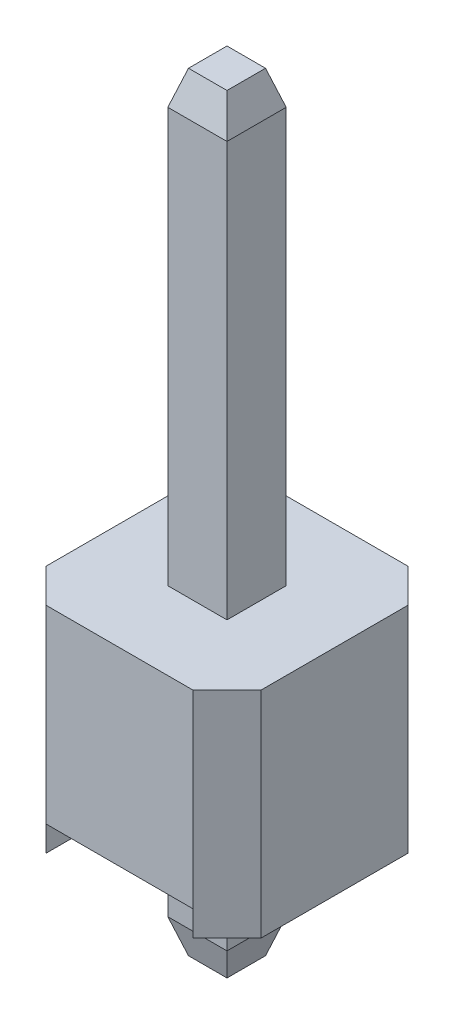
ISO-10303-21;
HEADER;
FILE_DESCRIPTION(('STEP AP214'),'2;1');
FILE_NAME('part.step','',(''),(''),'','','');
FILE_SCHEMA(('AUTOMOTIVE_DESIGN { 1 0 10303 214 1 1 1 1 }'));
ENDSEC;
DATA;
#1=APPLICATION_CONTEXT('core data for automotive mechanical design processes');
#2=APPLICATION_PROTOCOL_DEFINITION('international standard','automotive_design',2000,#1);
#3=PRODUCT_CONTEXT('',#1,'mechanical');
#4=PRODUCT('Part','Part','',(#3));
#5=PRODUCT_RELATED_PRODUCT_CATEGORY('part','',(#4));
#6=PRODUCT_DEFINITION_FORMATION('','',#4);
#7=PRODUCT_DEFINITION_CONTEXT('part definition',#1,'design');
#8=PRODUCT_DEFINITION('design','',#6,#7);
#9=PRODUCT_DEFINITION_SHAPE('','',#8);
#10=(LENGTH_UNIT() NAMED_UNIT(*) SI_UNIT(.MILLI.,.METRE.));
#11=(NAMED_UNIT(*) PLANE_ANGLE_UNIT() SI_UNIT($,.RADIAN.));
#12=(NAMED_UNIT(*) SI_UNIT($,.STERADIAN.) SOLID_ANGLE_UNIT());
#13=UNCERTAINTY_MEASURE_WITH_UNIT(LENGTH_MEASURE(1.E-05),#10,'distance_accuracy_value','');
#14=(GEOMETRIC_REPRESENTATION_CONTEXT(3) GLOBAL_UNCERTAINTY_ASSIGNED_CONTEXT((#13)) GLOBAL_UNIT_ASSIGNED_CONTEXT((#10,
#11,#12)) REPRESENTATION_CONTEXT('',''));
#15=CARTESIAN_POINT('',(0.,0.,0.));
#16=DIRECTION('',(0.,0.,1.));
#17=DIRECTION('',(1.,0.,0.));
#18=AXIS2_PLACEMENT_3D('',#15,#16,#17);
#19=CARTESIAN_POINT('',(0.,0.3,0.));
#20=DIRECTION('',(0.,-1.,0.));
#21=DIRECTION('',(0.,0.,-1.));
#22=AXIS2_PLACEMENT_3D('',#19,#20,#21);
#23=PLANE('',#22);
#24=DIRECTION('',(0.,0.,-1.));
#25=VECTOR('',#24,1.);
#26=CARTESIAN_POINT('',(-0.870000000000001,0.3,1.27));
#27=LINE('',#26,#25);
#28=CARTESIAN_POINT('',(-0.870000000000001,0.3,1.27));
#29=VERTEX_POINT('',#28);
#30=CARTESIAN_POINT('',(-0.870000000000001,0.3,-1.27));
#31=VERTEX_POINT('',#30);
#32=EDGE_CURVE('E237',#29,#31,#27,.T.);
#33=ORIENTED_EDGE('',*,*,#32,.T.);
#34=DIRECTION('',(1.,0.,0.));
#35=VECTOR('',#34,1.);
#36=CARTESIAN_POINT('',(-0.870000000000001,0.3,-1.27));
#37=LINE('',#36,#35);
#38=CARTESIAN_POINT('',(0.869999999999999,0.3,-1.27));
#39=VERTEX_POINT('',#38);
#40=EDGE_CURVE('E240',#31,#39,#37,.T.);
#41=ORIENTED_EDGE('',*,*,#40,.T.);
#42=DIRECTION('',(0.,0.,1.));
#43=VECTOR('',#42,1.);
#44=CARTESIAN_POINT('',(0.869999999999999,0.3,1.27));
#45=LINE('',#44,#43);
#46=CARTESIAN_POINT('',(0.869999999999999,0.3,1.27));
#47=VERTEX_POINT('',#46);
#48=EDGE_CURVE('E244',#39,#47,#45,.T.);
#49=ORIENTED_EDGE('',*,*,#48,.T.);
#50=DIRECTION('',(-1.,0.,0.));
#51=VECTOR('',#50,1.);
#52=CARTESIAN_POINT('',(-0.870000000000001,0.3,1.27));
#53=LINE('',#52,#51);
#54=EDGE_CURVE('E247',#47,#29,#53,.T.);
#55=ORIENTED_EDGE('',*,*,#54,.T.);
#56=EDGE_LOOP('',(#33,#41,#49,#55));
#57=FACE_BOUND('',#56,.T.);
#58=DIRECTION('',(-1.,0.,0.));
#59=VECTOR('',#58,1.);
#60=CARTESIAN_POINT('',(-0.35,0.3,0.35));
#61=LINE('',#60,#59);
#62=CARTESIAN_POINT('',(0.35,0.3,0.35));
#63=VERTEX_POINT('',#62);
#64=CARTESIAN_POINT('',(-0.35,0.3,0.35));
#65=VERTEX_POINT('',#64);
#66=EDGE_CURVE('E187',#63,#65,#61,.T.);
#67=ORIENTED_EDGE('',*,*,#66,.F.);
#68=DIRECTION('',(0.,0.,1.));
#69=VECTOR('',#68,1.);
#70=CARTESIAN_POINT('',(0.35,0.3,0.35));
#71=LINE('',#70,#69);
#72=CARTESIAN_POINT('',(0.35,0.3,-0.35));
#73=VERTEX_POINT('',#72);
#74=EDGE_CURVE('E197',#73,#63,#71,.T.);
#75=ORIENTED_EDGE('',*,*,#74,.F.);
#76=DIRECTION('',(1.,0.,0.));
#77=VECTOR('',#76,1.);
#78=CARTESIAN_POINT('',(-0.35,0.3,-0.35));
#79=LINE('',#78,#77);
#80=CARTESIAN_POINT('',(-0.35,0.3,-0.35));
#81=VERTEX_POINT('',#80);
#82=EDGE_CURVE('E209',#81,#73,#79,.T.);
#83=ORIENTED_EDGE('',*,*,#82,.F.);
#84=DIRECTION('',(0.,0.,-1.));
#85=VECTOR('',#84,1.);
#86=CARTESIAN_POINT('',(-0.35,0.3,0.35));
#87=LINE('',#86,#85);
#88=EDGE_CURVE('E207',#65,#81,#87,.T.);
#89=ORIENTED_EDGE('',*,*,#88,.F.);
#90=EDGE_LOOP('',(#67,#75,#83,#89));
#91=FACE_BOUND('',#90,.T.);
#92=ADVANCED_FACE('F33',(#57,#91),#23,.T.);
#93=CARTESIAN_POINT('',(0.,2.54,0.));
#94=DIRECTION('',(0.,1.,0.));
#95=DIRECTION('',(0.,0.,1.));
#96=AXIS2_PLACEMENT_3D('',#93,#94,#95);
#97=PLANE('',#96);
#98=DIRECTION('',(-1.,0.,0.));
#99=VECTOR('',#98,1.);
#100=CARTESIAN_POINT('',(-1.27,2.54,-1.27));
#101=LINE('',#100,#99);
#102=CARTESIAN_POINT('',(0.869999999999999,2.54,-1.27));
#103=VERTEX_POINT('',#102);
#104=CARTESIAN_POINT('',(-0.869999999999999,2.54,-1.27));
#105=VERTEX_POINT('',#104);
#106=EDGE_CURVE('E260',#103,#105,#101,.T.);
#107=ORIENTED_EDGE('',*,*,#106,.T.);
#108=DIRECTION('',(0.707106781186548,0.,-0.707106781186547));
#109=VECTOR('',#108,1.);
#110=CARTESIAN_POINT('',(-1.07,2.54,-1.07));
#111=LINE('',#110,#109);
#112=CARTESIAN_POINT('',(-1.27,2.54,-0.869999999999999));
#113=VERTEX_POINT('',#112);
#114=EDGE_CURVE('E301',#105,#113,#111,.F.);
#115=ORIENTED_EDGE('',*,*,#114,.T.);
#116=DIRECTION('',(0.,0.,1.));
#117=VECTOR('',#116,1.);
#118=CARTESIAN_POINT('',(-1.27,2.54,-1.27));
#119=LINE('',#118,#117);
#120=CARTESIAN_POINT('',(-1.27,2.54,0.869999999999999));
#121=VERTEX_POINT('',#120);
#122=EDGE_CURVE('E264',#113,#121,#119,.T.);
#123=ORIENTED_EDGE('',*,*,#122,.T.);
#124=DIRECTION('',(-0.707106781186546,0.,-0.707106781186549));
#125=VECTOR('',#124,1.);
#126=CARTESIAN_POINT('',(-1.07,2.54,1.07));
#127=LINE('',#126,#125);
#128=CARTESIAN_POINT('',(-0.87,2.54,1.27));
#129=VERTEX_POINT('',#128);
#130=EDGE_CURVE('E297',#121,#129,#127,.F.);
#131=ORIENTED_EDGE('',*,*,#130,.T.);
#132=DIRECTION('',(1.,0.,0.));
#133=VECTOR('',#132,1.);
#134=CARTESIAN_POINT('',(-1.27,2.54,1.27));
#135=LINE('',#134,#133);
#136=CARTESIAN_POINT('',(0.869999999999998,2.54,1.27));
#137=VERTEX_POINT('',#136);
#138=EDGE_CURVE('E267',#129,#137,#135,.T.);
#139=ORIENTED_EDGE('',*,*,#138,.T.);
#140=DIRECTION('',(-0.707106781186549,0.,0.707106781186546));
#141=VECTOR('',#140,1.);
#142=CARTESIAN_POINT('',(1.07,2.54,1.07));
#143=LINE('',#142,#141);
#144=CARTESIAN_POINT('',(1.27,2.54,0.869999999999999));
#145=VERTEX_POINT('',#144);
#146=EDGE_CURVE('E295',#137,#145,#143,.F.);
#147=ORIENTED_EDGE('',*,*,#146,.T.);
#148=DIRECTION('',(0.,0.,-1.));
#149=VECTOR('',#148,1.);
#150=CARTESIAN_POINT('',(1.27,2.54,-1.27));
#151=LINE('',#150,#149);
#152=CARTESIAN_POINT('',(1.27,2.54,-0.869999999999999));
#153=VERTEX_POINT('',#152);
#154=EDGE_CURVE('E257',#145,#153,#151,.T.);
#155=ORIENTED_EDGE('',*,*,#154,.T.);
#156=DIRECTION('',(0.707106781186547,0.,0.707106781186548));
#157=VECTOR('',#156,1.);
#158=CARTESIAN_POINT('',(1.07,2.54,-1.07));
#159=LINE('',#158,#157);
#160=EDGE_CURVE('E299',#153,#103,#159,.F.);
#161=ORIENTED_EDGE('',*,*,#160,.T.);
#162=EDGE_LOOP('',(#107,#115,#123,#131,#139,#147,#155,#161));
#163=FACE_BOUND('',#162,.T.);
#164=DIRECTION('',(1.,0.,0.));
#165=VECTOR('',#164,1.);
#166=CARTESIAN_POINT('',(0.35,2.54,0.35));
#167=LINE('',#166,#165);
#168=CARTESIAN_POINT('',(-0.35,2.54,0.35));
#169=VERTEX_POINT('',#168);
#170=CARTESIAN_POINT('',(0.35,2.54,0.35));
#171=VERTEX_POINT('',#170);
#172=EDGE_CURVE('E219',#169,#171,#167,.T.);
#173=ORIENTED_EDGE('',*,*,#172,.F.);
#174=DIRECTION('',(0.,0.,1.));
#175=VECTOR('',#174,1.);
#176=CARTESIAN_POINT('',(-0.35,2.54,-0.35));
#177=LINE('',#176,#175);
#178=CARTESIAN_POINT('',(-0.35,2.54,-0.35));
#179=VERTEX_POINT('',#178);
#180=EDGE_CURVE('E193',#179,#169,#177,.T.);
#181=ORIENTED_EDGE('',*,*,#180,.F.);
#182=DIRECTION('',(-1.,0.,0.));
#183=VECTOR('',#182,1.);
#184=CARTESIAN_POINT('',(0.35,2.54,-0.35));
#185=LINE('',#184,#183);
#186=CARTESIAN_POINT('',(0.35,2.54,-0.35));
#187=VERTEX_POINT('',#186);
#188=EDGE_CURVE('E225',#187,#179,#185,.T.);
#189=ORIENTED_EDGE('',*,*,#188,.F.);
#190=DIRECTION('',(0.,0.,-1.));
#191=VECTOR('',#190,1.);
#192=CARTESIAN_POINT('',(0.35,2.54,-0.35));
#193=LINE('',#192,#191);
#194=EDGE_CURVE('E222',#171,#187,#193,.T.);
#195=ORIENTED_EDGE('',*,*,#194,.F.);
#196=EDGE_LOOP('',(#173,#181,#189,#195));
#197=FACE_BOUND('',#196,.T.);
#198=ADVANCED_FACE('F397',(#163,#197),#97,.T.);
#199=CARTESIAN_POINT('',(-1.27,2.54,-1.27));
#200=DIRECTION('',(0.,0.,1.));
#201=DIRECTION('',(1.,0.,0.));
#202=AXIS2_PLACEMENT_3D('',#199,#200,#201);
#203=PLANE('',#202);
#204=ORIENTED_EDGE('',*,*,#40,.F.);
#205=DIRECTION('',(0.,1.,0.));
#206=VECTOR('',#205,1.);
#207=CARTESIAN_POINT('',(-0.869999999999999,2.54,-1.27));
#208=LINE('',#207,#206);
#209=EDGE_CURVE('E292',#31,#105,#208,.T.);
#210=ORIENTED_EDGE('',*,*,#209,.T.);
#211=ORIENTED_EDGE('',*,*,#106,.F.);
#212=DIRECTION('',(0.,-1.,0.));
#213=VECTOR('',#212,1.);
#214=CARTESIAN_POINT('',(0.869999999999999,2.54,-1.27));
#215=LINE('',#214,#213);
#216=EDGE_CURVE('E289',#103,#39,#215,.T.);
#217=ORIENTED_EDGE('',*,*,#216,.T.);
#218=EDGE_LOOP('',(#204,#210,#211,#217));
#219=FACE_BOUND('',#218,.T.);
#220=ADVANCED_FACE('F403',(#219),#203,.F.);
#221=CARTESIAN_POINT('',(-1.27,2.54,1.27));
#222=DIRECTION('',(0.,0.,-1.));
#223=DIRECTION('',(-1.,0.,0.));
#224=AXIS2_PLACEMENT_3D('',#221,#222,#223);
#225=PLANE('',#224);
#226=ORIENTED_EDGE('',*,*,#54,.F.);
#227=DIRECTION('',(0.,1.,0.));
#228=VECTOR('',#227,1.);
#229=CARTESIAN_POINT('',(0.869999999999999,2.54,1.27));
#230=LINE('',#229,#228);
#231=EDGE_CURVE('E308',#47,#137,#230,.T.);
#232=ORIENTED_EDGE('',*,*,#231,.T.);
#233=ORIENTED_EDGE('',*,*,#138,.F.);
#234=DIRECTION('',(0.,-1.,0.));
#235=VECTOR('',#234,1.);
#236=CARTESIAN_POINT('',(-0.87,2.54,1.27));
#237=LINE('',#236,#235);
#238=EDGE_CURVE('E311',#129,#29,#237,.T.);
#239=ORIENTED_EDGE('',*,*,#238,.T.);
#240=EDGE_LOOP('',(#226,#232,#233,#239));
#241=FACE_BOUND('',#240,.T.);
#242=ADVANCED_FACE('F425',(#241),#225,.F.);
#243=CARTESIAN_POINT('',(0.,0.,0.));
#244=DIRECTION('',(0.,1.,0.));
#245=DIRECTION('',(0.,0.,1.));
#246=AXIS2_PLACEMENT_3D('',#243,#244,#245);
#247=PLANE('',#246);
#248=DIRECTION('',(-0.707106781186548,0.,0.707106781186547));
#249=VECTOR('',#248,1.);
#250=CARTESIAN_POINT('',(-1.27,0.,-0.869999999999999));
#251=LINE('',#250,#249);
#252=CARTESIAN_POINT('',(-1.27,0.,-0.869999999999999));
#253=VERTEX_POINT('',#252);
#254=CARTESIAN_POINT('',(-0.870000000000001,0.,-1.27));
#255=VERTEX_POINT('',#254);
#256=EDGE_CURVE('E286',#253,#255,#251,.F.);
#257=ORIENTED_EDGE('',*,*,#256,.T.);
#258=DIRECTION('',(0.,0.,-1.));
#259=VECTOR('',#258,1.);
#260=CARTESIAN_POINT('',(-0.870000000000001,0.,1.27));
#261=LINE('',#260,#259);
#262=CARTESIAN_POINT('',(-0.870000000000001,0.,1.27));
#263=VERTEX_POINT('',#262);
#264=EDGE_CURVE('E236',#263,#255,#261,.T.);
#265=ORIENTED_EDGE('',*,*,#264,.F.);
#266=DIRECTION('',(0.707106781186546,0.,0.707106781186549));
#267=VECTOR('',#266,1.);
#268=CARTESIAN_POINT('',(-0.87,0.,1.27));
#269=LINE('',#268,#267);
#270=CARTESIAN_POINT('',(-1.27,0.,0.869999999999999));
#271=VERTEX_POINT('',#270);
#272=EDGE_CURVE('E282',#263,#271,#269,.F.);
#273=ORIENTED_EDGE('',*,*,#272,.T.);
#274=DIRECTION('',(0.,0.,1.));
#275=VECTOR('',#274,1.);
#276=CARTESIAN_POINT('',(-1.27,0.,-1.27));
#277=LINE('',#276,#275);
#278=EDGE_CURVE('E261',#253,#271,#277,.T.);
#279=ORIENTED_EDGE('',*,*,#278,.F.);
#280=EDGE_LOOP('',(#257,#265,#273,#279));
#281=FACE_BOUND('',#280,.T.);
#282=ADVANCED_FACE('F424',(#281),#247,.F.);
#283=CARTESIAN_POINT('',(1.27,2.54,-1.27));
#284=DIRECTION('',(-1.,0.,0.));
#285=DIRECTION('',(0.,0.,1.));
#286=AXIS2_PLACEMENT_3D('',#283,#284,#285);
#287=PLANE('',#286);
#288=DIRECTION('',(0.,0.,-1.));
#289=VECTOR('',#288,1.);
#290=CARTESIAN_POINT('',(1.27,0.,-1.27));
#291=LINE('',#290,#289);
#292=CARTESIAN_POINT('',(1.27,0.,0.87));
#293=VERTEX_POINT('',#292);
#294=CARTESIAN_POINT('',(1.27,0.,-0.869999999999998));
#295=VERTEX_POINT('',#294);
#296=EDGE_CURVE('E255',#293,#295,#291,.T.);
#297=ORIENTED_EDGE('',*,*,#296,.T.);
#298=DIRECTION('',(0.,1.,0.));
#299=VECTOR('',#298,1.);
#300=CARTESIAN_POINT('',(1.27,2.54,-0.869999999999998));
#301=LINE('',#300,#299);
#302=EDGE_CURVE('E306',#295,#153,#301,.T.);
#303=ORIENTED_EDGE('',*,*,#302,.T.);
#304=ORIENTED_EDGE('',*,*,#154,.F.);
#305=DIRECTION('',(0.,-1.,0.));
#306=VECTOR('',#305,1.);
#307=CARTESIAN_POINT('',(1.27,2.54,0.870000000000001));
#308=LINE('',#307,#306);
#309=EDGE_CURVE('E303',#145,#293,#308,.T.);
#310=ORIENTED_EDGE('',*,*,#309,.T.);
#311=EDGE_LOOP('',(#297,#303,#304,#310));
#312=FACE_BOUND('',#311,.T.);
#313=ADVANCED_FACE('F431',(#312),#287,.F.);
#314=CARTESIAN_POINT('',(-1.27,2.54,-1.27));
#315=DIRECTION('',(1.,0.,0.));
#316=DIRECTION('',(0.,0.,-1.));
#317=AXIS2_PLACEMENT_3D('',#314,#315,#316);
#318=PLANE('',#317);
#319=ORIENTED_EDGE('',*,*,#122,.F.);
#320=DIRECTION('',(0.,-1.,0.));
#321=VECTOR('',#320,1.);
#322=CARTESIAN_POINT('',(-1.27,2.54,-0.869999999999999));
#323=LINE('',#322,#321);
#324=EDGE_CURVE('E276',#113,#253,#323,.T.);
#325=ORIENTED_EDGE('',*,*,#324,.T.);
#326=ORIENTED_EDGE('',*,*,#278,.T.);
#327=DIRECTION('',(0.,1.,0.));
#328=VECTOR('',#327,1.);
#329=CARTESIAN_POINT('',(-1.27,2.54,0.869999999999999));
#330=LINE('',#329,#328);
#331=EDGE_CURVE('E270',#271,#121,#330,.T.);
#332=ORIENTED_EDGE('',*,*,#331,.T.);
#333=EDGE_LOOP('',(#319,#325,#326,#332));
#334=FACE_BOUND('',#333,.T.);
#335=ADVANCED_FACE('F422',(#334),#318,.F.);
#336=DIRECTION('',(0.707106781186549,0.,-0.707106781186546));
#337=VECTOR('',#336,1.);
#338=CARTESIAN_POINT('',(1.27,0.,0.870000000000001));
#339=LINE('',#338,#337);
#340=CARTESIAN_POINT('',(0.869999999999999,0.,1.27));
#341=VERTEX_POINT('',#340);
#342=EDGE_CURVE('E279',#293,#341,#339,.F.);
#343=ORIENTED_EDGE('',*,*,#342,.T.);
#344=DIRECTION('',(0.,0.,1.));
#345=VECTOR('',#344,1.);
#346=CARTESIAN_POINT('',(0.869999999999999,0.,1.27));
#347=LINE('',#346,#345);
#348=CARTESIAN_POINT('',(0.869999999999999,0.,-1.27));
#349=VERTEX_POINT('',#348);
#350=EDGE_CURVE('E241',#349,#341,#347,.T.);
#351=ORIENTED_EDGE('',*,*,#350,.F.);
#352=DIRECTION('',(-0.707106781186547,0.,-0.707106781186548));
#353=VECTOR('',#352,1.);
#354=CARTESIAN_POINT('',(0.869999999999999,0.,-1.27));
#355=LINE('',#354,#353);
#356=EDGE_CURVE('E284',#349,#295,#355,.F.);
#357=ORIENTED_EDGE('',*,*,#356,.T.);
#358=ORIENTED_EDGE('',*,*,#296,.F.);
#359=EDGE_LOOP('',(#343,#351,#357,#358));
#360=FACE_BOUND('',#359,.T.);
#361=ADVANCED_FACE('F418',(#360),#247,.F.);
#362=CARTESIAN_POINT('',(-1.27,2.54,-0.869999999999999));
#363=DIRECTION('',(0.707106781186547,0.,0.707106781186548));
#364=DIRECTION('',(0.,-1.,0.));
#365=AXIS2_PLACEMENT_3D('',#362,#363,#364);
#366=PLANE('',#365);
#367=ORIENTED_EDGE('',*,*,#114,.F.);
#368=ORIENTED_EDGE('',*,*,#209,.F.);
#369=EDGE_CURVE('E293',#255,#31,#208,.T.);
#370=ORIENTED_EDGE('',*,*,#369,.F.);
#371=ORIENTED_EDGE('',*,*,#256,.F.);
#372=ORIENTED_EDGE('',*,*,#324,.F.);
#373=EDGE_LOOP('',(#367,#368,#370,#371,#372));
#374=FACE_BOUND('',#373,.T.);
#375=ADVANCED_FACE('F421',(#374),#366,.F.);
#376=CARTESIAN_POINT('',(0.869999999999999,2.54,-1.27));
#377=DIRECTION('',(-0.707106781186548,0.,0.707106781186547));
#378=DIRECTION('',(0.,-1.,0.));
#379=AXIS2_PLACEMENT_3D('',#376,#377,#378);
#380=PLANE('',#379);
#381=ORIENTED_EDGE('',*,*,#160,.F.);
#382=ORIENTED_EDGE('',*,*,#302,.F.);
#383=ORIENTED_EDGE('',*,*,#356,.F.);
#384=DIRECTION('',(0.,-1.,0.));
#385=VECTOR('',#384,1.);
#386=CARTESIAN_POINT('',(0.869999999999999,0.3,-1.27));
#387=LINE('',#386,#385);
#388=EDGE_CURVE('E250',#39,#349,#387,.T.);
#389=ORIENTED_EDGE('',*,*,#388,.F.);
#390=ORIENTED_EDGE('',*,*,#216,.F.);
#391=EDGE_LOOP('',(#381,#382,#383,#389,#390));
#392=FACE_BOUND('',#391,.T.);
#393=ADVANCED_FACE('F441',(#392),#380,.F.);
#394=CARTESIAN_POINT('',(-0.87,2.54,1.27));
#395=DIRECTION('',(0.707106781186549,0.,-0.707106781186546));
#396=DIRECTION('',(0.,-1.,0.));
#397=AXIS2_PLACEMENT_3D('',#394,#395,#396);
#398=PLANE('',#397);
#399=ORIENTED_EDGE('',*,*,#130,.F.);
#400=ORIENTED_EDGE('',*,*,#331,.F.);
#401=ORIENTED_EDGE('',*,*,#272,.F.);
#402=DIRECTION('',(0.,-1.,0.));
#403=VECTOR('',#402,1.);
#404=CARTESIAN_POINT('',(-0.870000000000001,0.3,1.27));
#405=LINE('',#404,#403);
#406=EDGE_CURVE('E253',#29,#263,#405,.T.);
#407=ORIENTED_EDGE('',*,*,#406,.F.);
#408=ORIENTED_EDGE('',*,*,#238,.F.);
#409=EDGE_LOOP('',(#399,#400,#401,#407,#408));
#410=FACE_BOUND('',#409,.T.);
#411=ADVANCED_FACE('F445',(#410),#398,.F.);
#412=CARTESIAN_POINT('',(1.27,2.54,0.870000000000001));
#413=DIRECTION('',(-0.707106781186546,0.,-0.707106781186549));
#414=DIRECTION('',(0.,-1.,0.));
#415=AXIS2_PLACEMENT_3D('',#412,#413,#414);
#416=PLANE('',#415);
#417=ORIENTED_EDGE('',*,*,#146,.F.);
#418=ORIENTED_EDGE('',*,*,#231,.F.);
#419=EDGE_CURVE('E309',#341,#47,#230,.T.);
#420=ORIENTED_EDGE('',*,*,#419,.F.);
#421=ORIENTED_EDGE('',*,*,#342,.F.);
#422=ORIENTED_EDGE('',*,*,#309,.F.);
#423=EDGE_LOOP('',(#417,#418,#420,#421,#422));
#424=FACE_BOUND('',#423,.T.);
#425=ADVANCED_FACE('F415',(#424),#416,.F.);
#426=CARTESIAN_POINT('',(-0.870000000000001,0.3,1.27));
#427=DIRECTION('',(-1.,0.,0.));
#428=DIRECTION('',(0.,0.,1.));
#429=AXIS2_PLACEMENT_3D('',#426,#427,#428);
#430=PLANE('',#429);
#431=ORIENTED_EDGE('',*,*,#264,.T.);
#432=ORIENTED_EDGE('',*,*,#369,.T.);
#433=ORIENTED_EDGE('',*,*,#32,.F.);
#434=ORIENTED_EDGE('',*,*,#406,.T.);
#435=EDGE_LOOP('',(#431,#432,#433,#434));
#436=FACE_BOUND('',#435,.T.);
#437=ADVANCED_FACE('F412',(#436),#430,.F.);
#438=CARTESIAN_POINT('',(0.869999999999999,0.3,1.27));
#439=DIRECTION('',(1.,0.,0.));
#440=DIRECTION('',(0.,0.,-1.));
#441=AXIS2_PLACEMENT_3D('',#438,#439,#440);
#442=PLANE('',#441);
#443=ORIENTED_EDGE('',*,*,#350,.T.);
#444=ORIENTED_EDGE('',*,*,#419,.T.);
#445=ORIENTED_EDGE('',*,*,#48,.F.);
#446=ORIENTED_EDGE('',*,*,#388,.T.);
#447=EDGE_LOOP('',(#443,#444,#445,#446));
#448=FACE_BOUND('',#447,.T.);
#449=ADVANCED_FACE('F409',(#448),#442,.F.);
#450=CARTESIAN_POINT('',(-0.35,7.84,-0.35));
#451=DIRECTION('',(1.,0.,0.));
#452=DIRECTION('',(0.,0.,-1.));
#453=AXIS2_PLACEMENT_3D('',#450,#451,#452);
#454=PLANE('',#453);
#455=DIRECTION('',(0.,-1.,0.));
#456=VECTOR('',#455,1.);
#457=CARTESIAN_POINT('',(-0.35,7.84,0.35));
#458=LINE('',#457,#456);
#459=CARTESIAN_POINT('',(-0.35,7.44,0.35));
#460=VERTEX_POINT('',#459);
#461=EDGE_CURVE('E234',#460,#169,#458,.T.);
#462=ORIENTED_EDGE('',*,*,#461,.F.);
#463=DIRECTION('',(0.,0.,-1.));
#464=VECTOR('',#463,1.);
#465=CARTESIAN_POINT('',(-0.35,7.44,-0.35));
#466=LINE('',#465,#464);
#467=CARTESIAN_POINT('',(-0.35,7.44,-0.35));
#468=VERTEX_POINT('',#467);
#469=EDGE_CURVE('E343',#460,#468,#466,.T.);
#470=ORIENTED_EDGE('',*,*,#469,.T.);
#471=DIRECTION('',(0.,-1.,0.));
#472=VECTOR('',#471,1.);
#473=CARTESIAN_POINT('',(-0.35,7.84,-0.35));
#474=LINE('',#473,#472);
#475=EDGE_CURVE('E228',#468,#179,#474,.T.);
#476=ORIENTED_EDGE('',*,*,#475,.T.);
#477=ORIENTED_EDGE('',*,*,#180,.T.);
#478=EDGE_LOOP('',(#462,#470,#476,#477));
#479=FACE_BOUND('',#478,.T.);
#480=ADVANCED_FACE('F376',(#479),#454,.F.);
#481=CARTESIAN_POINT('',(0.35,7.84,0.35));
#482=DIRECTION('',(0.,0.,-1.));
#483=DIRECTION('',(-1.,0.,0.));
#484=AXIS2_PLACEMENT_3D('',#481,#482,#483);
#485=PLANE('',#484);
#486=DIRECTION('',(0.,-1.,0.));
#487=VECTOR('',#486,1.);
#488=CARTESIAN_POINT('',(0.35,7.84,0.35));
#489=LINE('',#488,#487);
#490=CARTESIAN_POINT('',(0.35,7.44,0.35));
#491=VERTEX_POINT('',#490);
#492=EDGE_CURVE('E232',#491,#171,#489,.T.);
#493=ORIENTED_EDGE('',*,*,#492,.F.);
#494=DIRECTION('',(-1.,0.,0.));
#495=VECTOR('',#494,1.);
#496=CARTESIAN_POINT('',(0.35,7.44,0.35));
#497=LINE('',#496,#495);
#498=EDGE_CURVE('E11',#491,#460,#497,.T.);
#499=ORIENTED_EDGE('',*,*,#498,.T.);
#500=ORIENTED_EDGE('',*,*,#461,.T.);
#501=ORIENTED_EDGE('',*,*,#172,.T.);
#502=EDGE_LOOP('',(#493,#499,#500,#501));
#503=FACE_BOUND('',#502,.T.);
#504=ADVANCED_FACE('F548',(#503),#485,.F.);
#505=CARTESIAN_POINT('',(0.35,7.84,-0.35));
#506=DIRECTION('',(-1.,0.,0.));
#507=DIRECTION('',(0.,0.,1.));
#508=AXIS2_PLACEMENT_3D('',#505,#506,#507);
#509=PLANE('',#508);
#510=DIRECTION('',(0.,-1.,0.));
#511=VECTOR('',#510,1.);
#512=CARTESIAN_POINT('',(0.35,7.84,-0.35));
#513=LINE('',#512,#511);
#514=CARTESIAN_POINT('',(0.35,7.44,-0.35));
#515=VERTEX_POINT('',#514);
#516=EDGE_CURVE('E230',#515,#187,#513,.T.);
#517=ORIENTED_EDGE('',*,*,#516,.F.);
#518=DIRECTION('',(0.,0.,1.));
#519=VECTOR('',#518,1.);
#520=CARTESIAN_POINT('',(0.35,7.44,-0.35));
#521=LINE('',#520,#519);
#522=EDGE_CURVE('E42',#515,#491,#521,.T.);
#523=ORIENTED_EDGE('',*,*,#522,.T.);
#524=ORIENTED_EDGE('',*,*,#492,.T.);
#525=ORIENTED_EDGE('',*,*,#194,.T.);
#526=EDGE_LOOP('',(#517,#523,#524,#525));
#527=FACE_BOUND('',#526,.T.);
#528=ADVANCED_FACE('F394',(#527),#509,.F.);
#529=CARTESIAN_POINT('',(0.35,7.84,-0.35));
#530=DIRECTION('',(0.,0.,1.));
#531=DIRECTION('',(1.,0.,0.));
#532=AXIS2_PLACEMENT_3D('',#529,#530,#531);
#533=PLANE('',#532);
#534=ORIENTED_EDGE('',*,*,#475,.F.);
#535=DIRECTION('',(1.,0.,0.));
#536=VECTOR('',#535,1.);
#537=CARTESIAN_POINT('',(0.35,7.44,-0.35));
#538=LINE('',#537,#536);
#539=EDGE_CURVE('E340',#468,#515,#538,.T.);
#540=ORIENTED_EDGE('',*,*,#539,.T.);
#541=ORIENTED_EDGE('',*,*,#516,.T.);
#542=ORIENTED_EDGE('',*,*,#188,.T.);
#543=EDGE_LOOP('',(#534,#540,#541,#542));
#544=FACE_BOUND('',#543,.T.);
#545=ADVANCED_FACE('F379',(#544),#533,.F.);
#546=CARTESIAN_POINT('',(0.,7.84,0.));
#547=DIRECTION('',(0.,-1.,0.));
#548=DIRECTION('',(0.,0.,-1.));
#549=AXIS2_PLACEMENT_3D('',#546,#547,#548);
#550=PLANE('',#549);
#551=DIRECTION('',(0.,0.,-1.));
#552=VECTOR('',#551,1.);
#553=CARTESIAN_POINT('',(0.227707727416536,7.84,0.));
#554=LINE('',#553,#552);
#555=CARTESIAN_POINT('',(0.227707727416536,7.84,0.227707727416536));
#556=VERTEX_POINT('',#555);
#557=CARTESIAN_POINT('',(0.227707727416536,7.84,-0.227707727416536));
#558=VERTEX_POINT('',#557);
#559=EDGE_CURVE('E333',#556,#558,#554,.T.);
#560=ORIENTED_EDGE('',*,*,#559,.T.);
#561=DIRECTION('',(-1.,0.,0.));
#562=VECTOR('',#561,1.);
#563=CARTESIAN_POINT('',(0.,7.84,-0.227707727416536));
#564=LINE('',#563,#562);
#565=CARTESIAN_POINT('',(-0.227707727416536,7.84,-0.227707727416536));
#566=VERTEX_POINT('',#565);
#567=EDGE_CURVE('E337',#558,#566,#564,.T.);
#568=ORIENTED_EDGE('',*,*,#567,.T.);
#569=DIRECTION('',(0.,0.,1.));
#570=VECTOR('',#569,1.);
#571=CARTESIAN_POINT('',(-0.227707727416536,7.84,0.));
#572=LINE('',#571,#570);
#573=CARTESIAN_POINT('',(-0.227707727416536,7.84,0.227707727416536));
#574=VERTEX_POINT('',#573);
#575=EDGE_CURVE('E335',#566,#574,#572,.T.);
#576=ORIENTED_EDGE('',*,*,#575,.T.);
#577=DIRECTION('',(1.,0.,0.));
#578=VECTOR('',#577,1.);
#579=CARTESIAN_POINT('',(0.,7.84,0.227707727416536));
#580=LINE('',#579,#578);
#581=EDGE_CURVE('E331',#574,#556,#580,.T.);
#582=ORIENTED_EDGE('',*,*,#581,.T.);
#583=EDGE_LOOP('',(#560,#568,#576,#582));
#584=FACE_BOUND('',#583,.T.);
#585=ADVANCED_FACE('F386',(#584),#550,.F.);
#586=CARTESIAN_POINT('',(0.35,-1.25,0.35));
#587=DIRECTION('',(-1.,0.,0.));
#588=DIRECTION('',(0.,0.,1.));
#589=AXIS2_PLACEMENT_3D('',#586,#587,#588);
#590=PLANE('',#589);
#591=DIRECTION('',(0.,1.,0.));
#592=VECTOR('',#591,1.);
#593=CARTESIAN_POINT('',(0.35,-1.25,0.35));
#594=LINE('',#593,#592);
#595=CARTESIAN_POINT('',(0.35,-0.849999999999997,0.35));
#596=VERTEX_POINT('',#595);
#597=EDGE_CURVE('E182',#596,#63,#594,.T.);
#598=ORIENTED_EDGE('',*,*,#597,.F.);
#599=DIRECTION('',(0.,0.,-1.));
#600=VECTOR('',#599,1.);
#601=CARTESIAN_POINT('',(0.35,-0.849999999999997,-0.35));
#602=LINE('',#601,#600);
#603=CARTESIAN_POINT('',(0.35,-0.849999999999997,-0.35));
#604=VERTEX_POINT('',#603);
#605=EDGE_CURVE('E328',#596,#604,#602,.T.);
#606=ORIENTED_EDGE('',*,*,#605,.T.);
#607=DIRECTION('',(0.,1.,0.));
#608=VECTOR('',#607,1.);
#609=CARTESIAN_POINT('',(0.35,-1.25,-0.35));
#610=LINE('',#609,#608);
#611=EDGE_CURVE('E200',#604,#73,#610,.T.);
#612=ORIENTED_EDGE('',*,*,#611,.T.);
#613=ORIENTED_EDGE('',*,*,#74,.T.);
#614=EDGE_LOOP('',(#598,#606,#612,#613));
#615=FACE_BOUND('',#614,.T.);
#616=ADVANCED_FACE('F198',(#615),#590,.F.);
#617=CARTESIAN_POINT('',(-0.35,-1.25,0.35));
#618=DIRECTION('',(0.,0.,-1.));
#619=DIRECTION('',(-1.,0.,0.));
#620=AXIS2_PLACEMENT_3D('',#617,#618,#619);
#621=PLANE('',#620);
#622=DIRECTION('',(0.,1.,0.));
#623=VECTOR('',#622,1.);
#624=CARTESIAN_POINT('',(-0.35,-1.25,0.35));
#625=LINE('',#624,#623);
#626=CARTESIAN_POINT('',(-0.35,-0.849999999999997,0.35));
#627=VERTEX_POINT('',#626);
#628=EDGE_CURVE('E194',#627,#65,#625,.T.);
#629=ORIENTED_EDGE('',*,*,#628,.F.);
#630=DIRECTION('',(1.,0.,0.));
#631=VECTOR('',#630,1.);
#632=CARTESIAN_POINT('',(0.35,-0.849999999999997,0.35));
#633=LINE('',#632,#631);
#634=EDGE_CURVE('E190',#627,#596,#633,.T.);
#635=ORIENTED_EDGE('',*,*,#634,.T.);
#636=ORIENTED_EDGE('',*,*,#597,.T.);
#637=ORIENTED_EDGE('',*,*,#66,.T.);
#638=EDGE_LOOP('',(#629,#635,#636,#637));
#639=FACE_BOUND('',#638,.T.);
#640=ADVANCED_FACE('F185',(#639),#621,.F.);
#641=CARTESIAN_POINT('',(-0.35,-1.25,0.35));
#642=DIRECTION('',(1.,0.,0.));
#643=DIRECTION('',(0.,0.,-1.));
#644=AXIS2_PLACEMENT_3D('',#641,#642,#643);
#645=PLANE('',#644);
#646=DIRECTION('',(0.,1.,0.));
#647=VECTOR('',#646,1.);
#648=CARTESIAN_POINT('',(-0.35,-1.25,-0.35));
#649=LINE('',#648,#647);
#650=CARTESIAN_POINT('',(-0.35,-0.849999999999997,-0.35));
#651=VERTEX_POINT('',#650);
#652=EDGE_CURVE('E214',#651,#81,#649,.T.);
#653=ORIENTED_EDGE('',*,*,#652,.F.);
#654=DIRECTION('',(0.,0.,1.));
#655=VECTOR('',#654,1.);
#656=CARTESIAN_POINT('',(-0.35,-0.849999999999997,0.35));
#657=LINE('',#656,#655);
#658=EDGE_CURVE('E326',#651,#627,#657,.T.);
#659=ORIENTED_EDGE('',*,*,#658,.T.);
#660=ORIENTED_EDGE('',*,*,#628,.T.);
#661=ORIENTED_EDGE('',*,*,#88,.T.);
#662=EDGE_LOOP('',(#653,#659,#660,#661));
#663=FACE_BOUND('',#662,.T.);
#664=ADVANCED_FACE('F509',(#663),#645,.F.);
#665=CARTESIAN_POINT('',(-0.35,-1.25,-0.35));
#666=DIRECTION('',(0.,0.,1.));
#667=DIRECTION('',(1.,0.,0.));
#668=AXIS2_PLACEMENT_3D('',#665,#666,#667);
#669=PLANE('',#668);
#670=ORIENTED_EDGE('',*,*,#611,.F.);
#671=DIRECTION('',(-1.,0.,0.));
#672=VECTOR('',#671,1.);
#673=CARTESIAN_POINT('',(-0.35,-0.849999999999997,-0.35));
#674=LINE('',#673,#672);
#675=EDGE_CURVE('E323',#604,#651,#674,.T.);
#676=ORIENTED_EDGE('',*,*,#675,.T.);
#677=ORIENTED_EDGE('',*,*,#652,.T.);
#678=ORIENTED_EDGE('',*,*,#82,.T.);
#679=EDGE_LOOP('',(#670,#676,#677,#678));
#680=FACE_BOUND('',#679,.T.);
#681=ADVANCED_FACE('F501',(#680),#669,.F.);
#682=CARTESIAN_POINT('',(0.,-1.25,0.));
#683=DIRECTION('',(0.,-1.,0.));
#684=DIRECTION('',(0.,0.,-1.));
#685=AXIS2_PLACEMENT_3D('',#682,#683,#684);
#686=PLANE('',#685);
#687=DIRECTION('',(0.,0.,-1.));
#688=VECTOR('',#687,1.);
#689=CARTESIAN_POINT('',(-0.227707727416536,-1.25,-0.35));
#690=LINE('',#689,#688);
#691=CARTESIAN_POINT('',(-0.227707727416536,-1.25,0.227707727416536));
#692=VERTEX_POINT('',#691);
#693=CARTESIAN_POINT('',(-0.227707727416536,-1.25,-0.227707727416536));
#694=VERTEX_POINT('',#693);
#695=EDGE_CURVE('E318',#692,#694,#690,.T.);
#696=ORIENTED_EDGE('',*,*,#695,.T.);
#697=DIRECTION('',(1.,0.,0.));
#698=VECTOR('',#697,1.);
#699=CARTESIAN_POINT('',(0.35,-1.25,-0.227707727416536));
#700=LINE('',#699,#698);
#701=CARTESIAN_POINT('',(0.227707727416536,-1.25,-0.227707727416536));
#702=VERTEX_POINT('',#701);
#703=EDGE_CURVE('E320',#694,#702,#700,.T.);
#704=ORIENTED_EDGE('',*,*,#703,.T.);
#705=DIRECTION('',(0.,0.,1.));
#706=VECTOR('',#705,1.);
#707=CARTESIAN_POINT('',(0.227707727416536,-1.25,0.35));
#708=LINE('',#707,#706);
#709=CARTESIAN_POINT('',(0.227707727416536,-1.25,0.227707727416536));
#710=VERTEX_POINT('',#709);
#711=EDGE_CURVE('E316',#702,#710,#708,.T.);
#712=ORIENTED_EDGE('',*,*,#711,.T.);
#713=DIRECTION('',(-1.,0.,0.));
#714=VECTOR('',#713,1.);
#715=CARTESIAN_POINT('',(-0.35,-1.25,0.227707727416536));
#716=LINE('',#715,#714);
#717=EDGE_CURVE('E314',#710,#692,#716,.T.);
#718=ORIENTED_EDGE('',*,*,#717,.T.);
#719=EDGE_LOOP('',(#696,#704,#712,#718));
#720=FACE_BOUND('',#719,.T.);
#721=ADVANCED_FACE('F468',(#720),#686,.T.);
#722=CARTESIAN_POINT('',(0.,-1.25,0.227707727416536));
#723=DIRECTION('',(0.,-0.292371704722734,0.956304755963036));
#724=DIRECTION('',(1.,0.,0.));
#725=AXIS2_PLACEMENT_3D('',#722,#723,#724);
#726=PLANE('',#725);
#727=DIRECTION('',(0.280623595142125,0.917878420979062,0.280623595142125));
#728=VECTOR('',#727,1.);
#729=CARTESIAN_POINT('',(0.209775834475891,-1.30865257897929,0.209775834475891));
#730=LINE('',#729,#728);
#731=EDGE_CURVE('E350',#596,#710,#730,.F.);
#732=ORIENTED_EDGE('',*,*,#731,.F.);
#733=ORIENTED_EDGE('',*,*,#634,.F.);
#734=DIRECTION('',(0.280623595142126,-0.917878420979062,-0.280623595142125));
#735=VECTOR('',#734,1.);
#736=CARTESIAN_POINT('',(-0.209775834475891,-1.30865257897929,0.209775834475891));
#737=LINE('',#736,#735);
#738=EDGE_CURVE('E204',#692,#627,#737,.F.);
#739=ORIENTED_EDGE('',*,*,#738,.F.);
#740=ORIENTED_EDGE('',*,*,#717,.F.);
#741=EDGE_LOOP('',(#732,#733,#739,#740));
#742=FACE_BOUND('',#741,.T.);
#743=ADVANCED_FACE('F464',(#742),#726,.T.);
#744=CARTESIAN_POINT('',(-0.227707727416536,-1.25,0.));
#745=DIRECTION('',(-0.956304755963036,-0.292371704722734,0.));
#746=DIRECTION('',(0.,0.,1.));
#747=AXIS2_PLACEMENT_3D('',#744,#745,#746);
#748=PLANE('',#747);
#749=ORIENTED_EDGE('',*,*,#738,.T.);
#750=ORIENTED_EDGE('',*,*,#658,.F.);
#751=DIRECTION('',(0.280623595142125,-0.917878420979062,0.280623595142125));
#752=VECTOR('',#751,1.);
#753=CARTESIAN_POINT('',(-0.209775834475891,-1.30865257897929,-0.209775834475891));
#754=LINE('',#753,#752);
#755=EDGE_CURVE('E348',#694,#651,#754,.F.);
#756=ORIENTED_EDGE('',*,*,#755,.F.);
#757=ORIENTED_EDGE('',*,*,#695,.F.);
#758=EDGE_LOOP('',(#749,#750,#756,#757));
#759=FACE_BOUND('',#758,.T.);
#760=ADVANCED_FACE('F460',(#759),#748,.T.);
#761=CARTESIAN_POINT('',(0.227707727416536,-1.25,0.));
#762=DIRECTION('',(0.956304755963036,-0.292371704722734,0.));
#763=DIRECTION('',(0.,0.,-1.));
#764=AXIS2_PLACEMENT_3D('',#761,#762,#763);
#765=PLANE('',#764);
#766=ORIENTED_EDGE('',*,*,#731,.T.);
#767=ORIENTED_EDGE('',*,*,#711,.F.);
#768=DIRECTION('',(0.280623595142126,0.917878420979062,-0.280623595142125));
#769=VECTOR('',#768,1.);
#770=CARTESIAN_POINT('',(0.209775834475891,-1.30865257897929,-0.209775834475891));
#771=LINE('',#770,#769);
#772=EDGE_CURVE('E346',#604,#702,#771,.F.);
#773=ORIENTED_EDGE('',*,*,#772,.F.);
#774=ORIENTED_EDGE('',*,*,#605,.F.);
#775=EDGE_LOOP('',(#766,#767,#773,#774));
#776=FACE_BOUND('',#775,.T.);
#777=ADVANCED_FACE('F456',(#776),#765,.T.);
#778=CARTESIAN_POINT('',(0.,-1.25,-0.227707727416536));
#779=DIRECTION('',(0.,-0.292371704722734,-0.956304755963036));
#780=DIRECTION('',(-1.,0.,0.));
#781=AXIS2_PLACEMENT_3D('',#778,#779,#780);
#782=PLANE('',#781);
#783=ORIENTED_EDGE('',*,*,#755,.T.);
#784=ORIENTED_EDGE('',*,*,#675,.F.);
#785=ORIENTED_EDGE('',*,*,#772,.T.);
#786=ORIENTED_EDGE('',*,*,#703,.F.);
#787=EDGE_LOOP('',(#783,#784,#785,#786));
#788=FACE_BOUND('',#787,.T.);
#789=ADVANCED_FACE('F453',(#788),#782,.T.);
#790=CARTESIAN_POINT('',(0.,7.84,0.227707727416536));
#791=DIRECTION('',(0.,-0.292371704722735,-0.956304755963036));
#792=DIRECTION('',(1.,0.,0.));
#793=AXIS2_PLACEMENT_3D('',#790,#791,#792);
#794=PLANE('',#793);
#795=DIRECTION('',(-0.280623595142126,-0.917878420979062,0.280623595142126));
#796=VECTOR('',#795,1.);
#797=CARTESIAN_POINT('',(-0.209775834475891,7.89865257897929,0.209775834475891));
#798=LINE('',#797,#796);
#799=EDGE_CURVE('E358',#460,#574,#798,.F.);
#800=ORIENTED_EDGE('',*,*,#799,.F.);
#801=ORIENTED_EDGE('',*,*,#498,.F.);
#802=DIRECTION('',(-0.280623595142126,0.917878420979062,-0.280623595142126));
#803=VECTOR('',#802,1.);
#804=CARTESIAN_POINT('',(0.209775834475891,7.89865257897929,0.209775834475891));
#805=LINE('',#804,#803);
#806=EDGE_CURVE('E37',#556,#491,#805,.F.);
#807=ORIENTED_EDGE('',*,*,#806,.F.);
#808=ORIENTED_EDGE('',*,*,#581,.F.);
#809=EDGE_LOOP('',(#800,#801,#807,#808));
#810=FACE_BOUND('',#809,.T.);
#811=ADVANCED_FACE('F35',(#810),#794,.F.);
#812=CARTESIAN_POINT('',(0.227707727416536,7.84,0.));
#813=DIRECTION('',(-0.956304755963036,-0.292371704722735,0.));
#814=DIRECTION('',(0.,0.,-1.));
#815=AXIS2_PLACEMENT_3D('',#812,#813,#814);
#816=PLANE('',#815);
#817=ORIENTED_EDGE('',*,*,#806,.T.);
#818=ORIENTED_EDGE('',*,*,#522,.F.);
#819=DIRECTION('',(-0.280623595142126,0.917878420979062,0.280623595142126));
#820=VECTOR('',#819,1.);
#821=CARTESIAN_POINT('',(0.209775834475891,7.89865257897929,-0.209775834475891));
#822=LINE('',#821,#820);
#823=EDGE_CURVE('E357',#558,#515,#822,.F.);
#824=ORIENTED_EDGE('',*,*,#823,.F.);
#825=ORIENTED_EDGE('',*,*,#559,.F.);
#826=EDGE_LOOP('',(#817,#818,#824,#825));
#827=FACE_BOUND('',#826,.T.);
#828=ADVANCED_FACE('F368',(#827),#816,.F.);
#829=CARTESIAN_POINT('',(-0.227707727416536,7.84,0.));
#830=DIRECTION('',(0.956304755963036,-0.292371704722735,0.));
#831=DIRECTION('',(0.,0.,1.));
#832=AXIS2_PLACEMENT_3D('',#829,#830,#831);
#833=PLANE('',#832);
#834=ORIENTED_EDGE('',*,*,#799,.T.);
#835=ORIENTED_EDGE('',*,*,#575,.F.);
#836=DIRECTION('',(-0.280623595142126,-0.917878420979062,-0.280623595142126));
#837=VECTOR('',#836,1.);
#838=CARTESIAN_POINT('',(-0.209775834475891,7.89865257897929,-0.209775834475891));
#839=LINE('',#838,#837);
#840=EDGE_CURVE('E355',#468,#566,#839,.F.);
#841=ORIENTED_EDGE('',*,*,#840,.F.);
#842=ORIENTED_EDGE('',*,*,#469,.F.);
#843=EDGE_LOOP('',(#834,#835,#841,#842));
#844=FACE_BOUND('',#843,.T.);
#845=ADVANCED_FACE('F373',(#844),#833,.F.);
#846=CARTESIAN_POINT('',(0.,7.84,-0.227707727416536));
#847=DIRECTION('',(0.,-0.292371704722735,0.956304755963036));
#848=DIRECTION('',(-1.,0.,0.));
#849=AXIS2_PLACEMENT_3D('',#846,#847,#848);
#850=PLANE('',#849);
#851=ORIENTED_EDGE('',*,*,#823,.T.);
#852=ORIENTED_EDGE('',*,*,#539,.F.);
#853=ORIENTED_EDGE('',*,*,#840,.T.);
#854=ORIENTED_EDGE('',*,*,#567,.F.);
#855=EDGE_LOOP('',(#851,#852,#853,#854));
#856=FACE_BOUND('',#855,.T.);
#857=ADVANCED_FACE('F383',(#856),#850,.F.);
#858=CLOSED_SHELL('',(#92,#198,#220,#242,#282,#313,#335,#361,#375,#393,#411,#425,#437,#449,#480,
#504,#528,#545,#585,#616,#640,#664,#681,#721,#743,#760,#777,#789,#811,#828,#845,#857));
#859=MANIFOLD_SOLID_BREP('B2',#858);
#860=ADVANCED_BREP_SHAPE_REPRESENTATION('',(#18,#859),#14);
#861=SHAPE_DEFINITION_REPRESENTATION(#9,#860);
ENDSEC;
END-ISO-10303-21;
